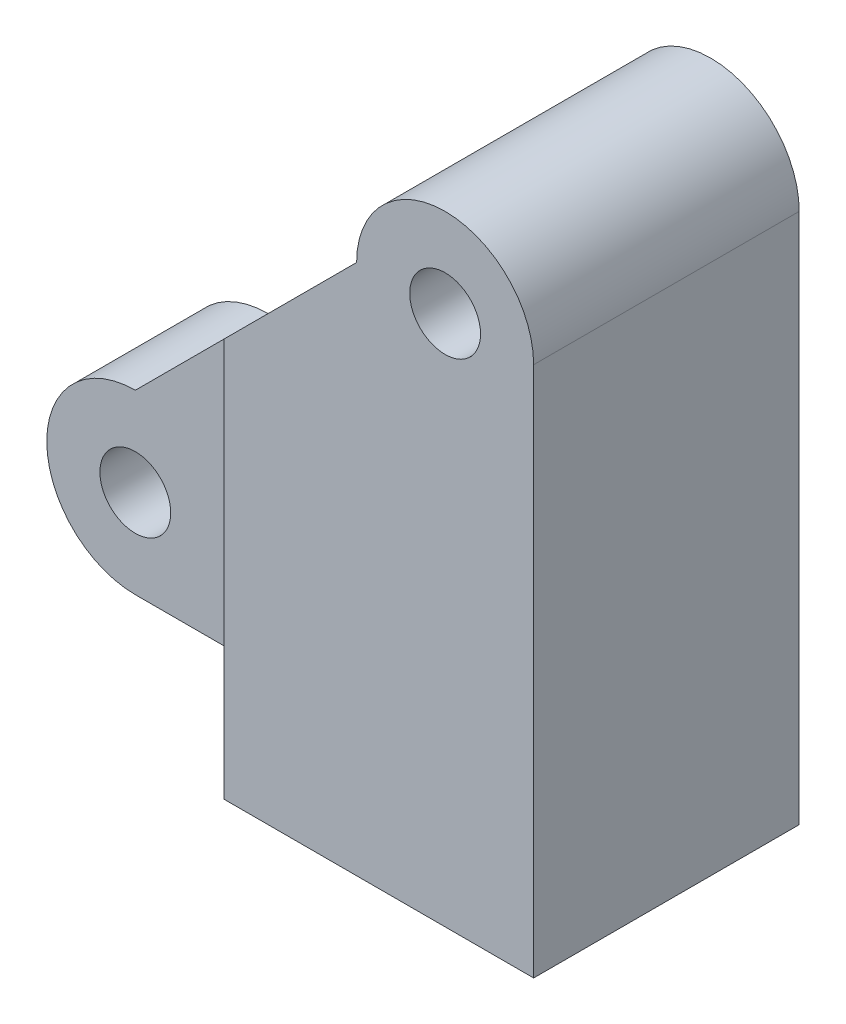
ISO-10303-21;
HEADER;
FILE_DESCRIPTION(('STEP AP214'),'2;1');
FILE_NAME('part.step','',(''),(''),'','','');
FILE_SCHEMA(('AUTOMOTIVE_DESIGN { 1 0 10303 214 1 1 1 1 }'));
ENDSEC;
DATA;
#1=APPLICATION_CONTEXT('core data for automotive mechanical design processes');
#2=APPLICATION_PROTOCOL_DEFINITION('international standard','automotive_design',2000,#1);
#3=PRODUCT_CONTEXT('',#1,'mechanical');
#4=PRODUCT('Part','Part','',(#3));
#5=PRODUCT_RELATED_PRODUCT_CATEGORY('part','',(#4));
#6=PRODUCT_DEFINITION_FORMATION('','',#4);
#7=PRODUCT_DEFINITION_CONTEXT('part definition',#1,'design');
#8=PRODUCT_DEFINITION('design','',#6,#7);
#9=PRODUCT_DEFINITION_SHAPE('','',#8);
#10=(LENGTH_UNIT() NAMED_UNIT(*) SI_UNIT(.MILLI.,.METRE.));
#11=(NAMED_UNIT(*) PLANE_ANGLE_UNIT() SI_UNIT($,.RADIAN.));
#12=(NAMED_UNIT(*) SI_UNIT($,.STERADIAN.) SOLID_ANGLE_UNIT());
#13=UNCERTAINTY_MEASURE_WITH_UNIT(LENGTH_MEASURE(1.E-05),#10,'distance_accuracy_value','');
#14=(GEOMETRIC_REPRESENTATION_CONTEXT(3) GLOBAL_UNCERTAINTY_ASSIGNED_CONTEXT((#13)) GLOBAL_UNIT_ASSIGNED_CONTEXT((#10,
#11,#12)) REPRESENTATION_CONTEXT('',''));
#15=CARTESIAN_POINT('',(0.,0.,0.));
#16=DIRECTION('',(0.,0.,1.));
#17=DIRECTION('',(1.,0.,0.));
#18=AXIS2_PLACEMENT_3D('',#15,#16,#17);
#19=CARTESIAN_POINT('',(15.1311870527181,7.1746239044065,23.4600678301874));
#20=DIRECTION('',(0.,0.,-1.));
#21=DIRECTION('',(-1.,0.,0.));
#22=AXIS2_PLACEMENT_3D('',#19,#20,#21);
#23=CYLINDRICAL_SURFACE('',#22,6.);
#24=CARTESIAN_POINT('',(15.1311870527181,7.1746239044065,14.4600678301874));
#25=DIRECTION('',(0.,0.,1.));
#26=DIRECTION('',(1.,0.,0.));
#27=AXIS2_PLACEMENT_3D('',#24,#25,#26);
#28=CIRCLE('',#27,6.);
#29=CARTESIAN_POINT('',(15.1311870527181,13.1746239044065,14.4600678301874));
#30=VERTEX_POINT('',#29);
#31=CARTESIAN_POINT('',(15.1311870527181,1.17462390440649,14.4600678301874));
#32=VERTEX_POINT('',#31);
#33=EDGE_CURVE('E116',#30,#32,#28,.T.);
#34=ORIENTED_EDGE('',*,*,#33,.F.);
#35=DIRECTION('',(0.,0.,-1.));
#36=VECTOR('',#35,1.);
#37=CARTESIAN_POINT('',(15.1311870527181,13.1746239044065,23.4600678301874));
#38=LINE('',#37,#36);
#39=CARTESIAN_POINT('',(15.1311870527181,13.1746239044065,5.46006783018738));
#40=VERTEX_POINT('',#39);
#41=EDGE_CURVE('E85',#30,#40,#38,.T.);
#42=ORIENTED_EDGE('',*,*,#41,.T.);
#43=CARTESIAN_POINT('',(15.1311870527181,7.1746239044065,5.46006783018738));
#44=DIRECTION('',(0.,0.,1.));
#45=DIRECTION('',(1.,0.,0.));
#46=AXIS2_PLACEMENT_3D('',#43,#44,#45);
#47=CIRCLE('',#46,6.);
#48=CARTESIAN_POINT('',(15.1311870527181,1.17462390440649,5.46006783018738));
#49=VERTEX_POINT('',#48);
#50=EDGE_CURVE('E134',#40,#49,#47,.T.);
#51=ORIENTED_EDGE('',*,*,#50,.T.);
#52=DIRECTION('',(0.,0.,-1.));
#53=VECTOR('',#52,1.);
#54=CARTESIAN_POINT('',(15.1311870527181,1.17462390440649,23.4600678301874));
#55=LINE('',#54,#53);
#56=EDGE_CURVE('E11',#32,#49,#55,.T.);
#57=ORIENTED_EDGE('',*,*,#56,.F.);
#58=EDGE_LOOP('',(#34,#42,#51,#57));
#59=FACE_BOUND('',#58,.T.);
#60=ADVANCED_FACE('F39',(#59),#23,.T.);
#61=CARTESIAN_POINT('',(15.1311870527181,7.1746239044065,23.4600678301874));
#62=DIRECTION('',(0.,0.,-1.));
#63=DIRECTION('',(-1.,0.,0.));
#64=AXIS2_PLACEMENT_3D('',#61,#62,#63);
#65=CYLINDRICAL_SURFACE('',#64,2.4);
#66=CARTESIAN_POINT('',(15.1311870527181,7.1746239044065,5.46006783018738));
#67=DIRECTION('',(0.,0.,1.));
#68=DIRECTION('',(1.,0.,0.));
#69=AXIS2_PLACEMENT_3D('',#66,#67,#68);
#70=CIRCLE('',#69,2.4);
#71=CARTESIAN_POINT('',(17.5311870527181,7.1746239044065,5.46006783018738));
#72=VERTEX_POINT('',#71);
#73=EDGE_CURVE('E123',#72,#72,#70,.T.);
#74=ORIENTED_EDGE('',*,*,#73,.F.);
#75=EDGE_LOOP('',(#74));
#76=FACE_BOUND('',#75,.T.);
#77=CARTESIAN_POINT('',(15.1311870527181,7.1746239044065,14.4600678301874));
#78=DIRECTION('',(0.,0.,1.));
#79=DIRECTION('',(1.,0.,0.));
#80=AXIS2_PLACEMENT_3D('',#77,#78,#79);
#81=CIRCLE('',#80,2.4);
#82=CARTESIAN_POINT('',(17.5311870527181,7.1746239044065,14.4600678301874));
#83=VERTEX_POINT('',#82);
#84=EDGE_CURVE('E119',#83,#83,#81,.F.);
#85=ORIENTED_EDGE('',*,*,#84,.F.);
#86=EDGE_LOOP('',(#85));
#87=FACE_BOUND('',#86,.T.);
#88=ADVANCED_FACE('F183',(#76,#87),#65,.F.);
#89=CARTESIAN_POINT('',(15.1311870527181,7.1746239044065,23.4600678301874));
#90=DIRECTION('',(0.,0.,1.));
#91=DIRECTION('',(1.,0.,0.));
#92=AXIS2_PLACEMENT_3D('',#89,#90,#91);
#93=PLANE('',#92);
#94=DIRECTION('',(0.,1.,0.));
#95=VECTOR('',#94,1.);
#96=CARTESIAN_POINT('',(30.1311870527181,7.1746239044065,23.4600678301874));
#97=LINE('',#96,#95);
#98=CARTESIAN_POINT('',(30.1311870527181,1.17462390440649,23.4600678301874));
#99=VERTEX_POINT('',#98);
#100=CARTESIAN_POINT('',(30.1311870527181,28.1746239044065,23.4600678301874));
#101=VERTEX_POINT('',#100);
#102=EDGE_CURVE('E178',#99,#101,#97,.T.);
#103=ORIENTED_EDGE('',*,*,#102,.F.);
#104=DIRECTION('',(1.,0.,0.));
#105=VECTOR('',#104,1.);
#106=CARTESIAN_POINT('',(15.1311870527181,1.17462390440649,23.4600678301874));
#107=LINE('',#106,#105);
#108=CARTESIAN_POINT('',(51.1311870527181,1.17462390440649,23.4600678301874));
#109=VERTEX_POINT('',#108);
#110=EDGE_CURVE('E90',#99,#109,#107,.T.);
#111=ORIENTED_EDGE('',*,*,#110,.T.);
#112=DIRECTION('',(0.,1.,0.));
#113=VECTOR('',#112,1.);
#114=CARTESIAN_POINT('',(51.1311870527181,1.17462390440649,23.4600678301874));
#115=LINE('',#114,#113);
#116=CARTESIAN_POINT('',(51.1311870527181,37.1746239044065,23.4600678301874));
#117=VERTEX_POINT('',#116);
#118=EDGE_CURVE('E138',#109,#117,#115,.T.);
#119=ORIENTED_EDGE('',*,*,#118,.T.);
#120=CARTESIAN_POINT('',(45.1311870527181,37.1746239044065,23.4600678301874));
#121=DIRECTION('',(0.,0.,1.));
#122=DIRECTION('',(1.,0.,0.));
#123=AXIS2_PLACEMENT_3D('',#120,#121,#122);
#124=CIRCLE('',#123,6.);
#125=CARTESIAN_POINT('',(39.1311870527181,37.1746239044065,23.4600678301874));
#126=VERTEX_POINT('',#125);
#127=EDGE_CURVE('E62',#117,#126,#124,.T.);
#128=ORIENTED_EDGE('',*,*,#127,.T.);
#129=DIRECTION('',(-0.707106781186548,-0.707106781186548,0.));
#130=VECTOR('',#129,1.);
#131=CARTESIAN_POINT('',(39.1311870527181,37.1746239044065,23.4600678301874));
#132=LINE('',#131,#130);
#133=EDGE_CURVE('E142',#126,#101,#132,.T.);
#134=ORIENTED_EDGE('',*,*,#133,.T.);
#135=EDGE_LOOP('',(#103,#111,#119,#128,#134));
#136=FACE_BOUND('',#135,.T.);
#137=CARTESIAN_POINT('',(45.1311870527181,37.1746239044065,23.4600678301874));
#138=DIRECTION('',(0.,0.,1.));
#139=DIRECTION('',(1.,0.,0.));
#140=AXIS2_PLACEMENT_3D('',#137,#138,#139);
#141=CIRCLE('',#140,2.4);
#142=CARTESIAN_POINT('',(47.5311870527181,37.1746239044065,23.4600678301874));
#143=VERTEX_POINT('',#142);
#144=EDGE_CURVE('E131',#143,#143,#141,.T.);
#145=ORIENTED_EDGE('',*,*,#144,.F.);
#146=EDGE_LOOP('',(#145));
#147=FACE_BOUND('',#146,.T.);
#148=ADVANCED_FACE('F176',(#136,#147),#93,.T.);
#149=CARTESIAN_POINT('',(15.1311870527181,7.1746239044065,5.46006783018738));
#150=DIRECTION('',(0.,0.,1.));
#151=DIRECTION('',(1.,0.,0.));
#152=AXIS2_PLACEMENT_3D('',#149,#150,#151);
#153=PLANE('',#152);
#154=ORIENTED_EDGE('',*,*,#50,.F.);
#155=DIRECTION('',(-0.707106781186548,-0.707106781186548,0.));
#156=VECTOR('',#155,1.);
#157=CARTESIAN_POINT('',(39.1311870527181,37.1746239044065,5.46006783018738));
#158=LINE('',#157,#156);
#159=CARTESIAN_POINT('',(39.1311870527181,37.1746239044065,5.46006783018738));
#160=VERTEX_POINT('',#159);
#161=EDGE_CURVE('E139',#160,#40,#158,.T.);
#162=ORIENTED_EDGE('',*,*,#161,.F.);
#163=CARTESIAN_POINT('',(45.1311870527181,37.1746239044065,5.46006783018738));
#164=DIRECTION('',(0.,0.,1.));
#165=DIRECTION('',(1.,0.,0.));
#166=AXIS2_PLACEMENT_3D('',#163,#164,#165);
#167=CIRCLE('',#166,6.);
#168=CARTESIAN_POINT('',(51.1311870527181,37.1746239044065,5.46006783018738));
#169=VERTEX_POINT('',#168);
#170=EDGE_CURVE('E149',#169,#160,#167,.T.);
#171=ORIENTED_EDGE('',*,*,#170,.F.);
#172=DIRECTION('',(0.,1.,0.));
#173=VECTOR('',#172,1.);
#174=CARTESIAN_POINT('',(51.1311870527181,1.17462390440649,5.46006783018738));
#175=LINE('',#174,#173);
#176=CARTESIAN_POINT('',(51.1311870527181,1.17462390440649,5.46006783018738));
#177=VERTEX_POINT('',#176);
#178=EDGE_CURVE('E147',#177,#169,#175,.T.);
#179=ORIENTED_EDGE('',*,*,#178,.F.);
#180=DIRECTION('',(1.,0.,0.));
#181=VECTOR('',#180,1.);
#182=CARTESIAN_POINT('',(15.1311870527181,1.17462390440649,5.46006783018738));
#183=LINE('',#182,#181);
#184=EDGE_CURVE('E145',#49,#177,#183,.T.);
#185=ORIENTED_EDGE('',*,*,#184,.F.);
#186=EDGE_LOOP('',(#154,#162,#171,#179,#185));
#187=FACE_BOUND('',#186,.T.);
#188=CARTESIAN_POINT('',(45.1311870527181,37.1746239044065,5.46006783018738));
#189=DIRECTION('',(0.,0.,1.));
#190=DIRECTION('',(1.,0.,0.));
#191=AXIS2_PLACEMENT_3D('',#188,#189,#190);
#192=CIRCLE('',#191,2.4);
#193=CARTESIAN_POINT('',(47.5311870527181,37.1746239044065,5.46006783018738));
#194=VERTEX_POINT('',#193);
#195=EDGE_CURVE('E130',#194,#194,#192,.T.);
#196=ORIENTED_EDGE('',*,*,#195,.T.);
#197=EDGE_LOOP('',(#196));
#198=FACE_BOUND('',#197,.T.);
#199=ORIENTED_EDGE('',*,*,#73,.T.);
#200=EDGE_LOOP('',(#199));
#201=FACE_BOUND('',#200,.T.);
#202=ADVANCED_FACE('F168',(#187,#198,#201),#153,.F.);
#203=CARTESIAN_POINT('',(15.1311870527181,1.17462390440649,23.4600678301874));
#204=DIRECTION('',(0.,1.,0.));
#205=DIRECTION('',(0.,0.,1.));
#206=AXIS2_PLACEMENT_3D('',#203,#204,#205);
#207=PLANE('',#206);
#208=ORIENTED_EDGE('',*,*,#110,.F.);
#209=DIRECTION('',(0.,0.,1.));
#210=VECTOR('',#209,1.);
#211=CARTESIAN_POINT('',(30.1311870527181,1.17462390440649,14.4600678301874));
#212=LINE('',#211,#210);
#213=CARTESIAN_POINT('',(30.1311870527181,1.17462390440649,14.4600678301874));
#214=VERTEX_POINT('',#213);
#215=EDGE_CURVE('E107',#214,#99,#212,.T.);
#216=ORIENTED_EDGE('',*,*,#215,.F.);
#217=DIRECTION('',(1.,0.,0.));
#218=VECTOR('',#217,1.);
#219=CARTESIAN_POINT('',(15.1311870527181,1.17462390440649,14.4600678301874));
#220=LINE('',#219,#218);
#221=EDGE_CURVE('E112',#32,#214,#220,.T.);
#222=ORIENTED_EDGE('',*,*,#221,.F.);
#223=ORIENTED_EDGE('',*,*,#56,.T.);
#224=ORIENTED_EDGE('',*,*,#184,.T.);
#225=DIRECTION('',(0.,0.,-1.));
#226=VECTOR('',#225,1.);
#227=CARTESIAN_POINT('',(51.1311870527181,1.17462390440649,23.4600678301874));
#228=LINE('',#227,#226);
#229=EDGE_CURVE('E46',#109,#177,#228,.T.);
#230=ORIENTED_EDGE('',*,*,#229,.F.);
#231=EDGE_LOOP('',(#208,#216,#222,#223,#224,#230));
#232=FACE_BOUND('',#231,.T.);
#233=ADVANCED_FACE('F121',(#232),#207,.F.);
#234=CARTESIAN_POINT('',(51.1311870527181,1.17462390440649,23.4600678301874));
#235=DIRECTION('',(-1.,0.,0.));
#236=DIRECTION('',(0.,0.,1.));
#237=AXIS2_PLACEMENT_3D('',#234,#235,#236);
#238=PLANE('',#237);
#239=ORIENTED_EDGE('',*,*,#178,.T.);
#240=DIRECTION('',(0.,0.,-1.));
#241=VECTOR('',#240,1.);
#242=CARTESIAN_POINT('',(51.1311870527181,37.1746239044065,23.4600678301874));
#243=LINE('',#242,#241);
#244=EDGE_CURVE('E156',#117,#169,#243,.T.);
#245=ORIENTED_EDGE('',*,*,#244,.F.);
#246=ORIENTED_EDGE('',*,*,#118,.F.);
#247=ORIENTED_EDGE('',*,*,#229,.T.);
#248=EDGE_LOOP('',(#239,#245,#246,#247));
#249=FACE_BOUND('',#248,.T.);
#250=ADVANCED_FACE('F162',(#249),#238,.F.);
#251=CARTESIAN_POINT('',(45.1311870527181,37.1746239044065,23.4600678301874));
#252=DIRECTION('',(0.,0.,-1.));
#253=DIRECTION('',(-1.,0.,0.));
#254=AXIS2_PLACEMENT_3D('',#251,#252,#253);
#255=CYLINDRICAL_SURFACE('',#254,6.);
#256=ORIENTED_EDGE('',*,*,#170,.T.);
#257=DIRECTION('',(0.,0.,-1.));
#258=VECTOR('',#257,1.);
#259=CARTESIAN_POINT('',(39.1311870527181,37.1746239044065,23.4600678301874));
#260=LINE('',#259,#258);
#261=EDGE_CURVE('E153',#126,#160,#260,.T.);
#262=ORIENTED_EDGE('',*,*,#261,.F.);
#263=ORIENTED_EDGE('',*,*,#127,.F.);
#264=ORIENTED_EDGE('',*,*,#244,.T.);
#265=EDGE_LOOP('',(#256,#262,#263,#264));
#266=FACE_BOUND('',#265,.T.);
#267=ADVANCED_FACE('F172',(#266),#255,.T.);
#268=CARTESIAN_POINT('',(39.1311870527181,37.1746239044065,23.4600678301874));
#269=DIRECTION('',(0.707106781186547,-0.707106781186547,0.));
#270=DIRECTION('',(0.707106781186548,0.707106781186548,0.));
#271=AXIS2_PLACEMENT_3D('',#268,#269,#270);
#272=PLANE('',#271);
#273=DIRECTION('',(-0.707106781186548,-0.707106781186548,0.));
#274=VECTOR('',#273,1.);
#275=CARTESIAN_POINT('',(12.1311870527181,10.1746239044065,14.4600678301874));
#276=LINE('',#275,#274);
#277=CARTESIAN_POINT('',(30.1311870527181,28.1746239044065,14.4600678301874));
#278=VERTEX_POINT('',#277);
#279=EDGE_CURVE('E111',#278,#30,#276,.T.);
#280=ORIENTED_EDGE('',*,*,#279,.F.);
#281=DIRECTION('',(0.,0.,1.));
#282=VECTOR('',#281,1.);
#283=CARTESIAN_POINT('',(30.1311870527181,28.1746239044065,14.4600678301874));
#284=LINE('',#283,#282);
#285=EDGE_CURVE('E109',#278,#101,#284,.T.);
#286=ORIENTED_EDGE('',*,*,#285,.T.);
#287=ORIENTED_EDGE('',*,*,#133,.F.);
#288=ORIENTED_EDGE('',*,*,#261,.T.);
#289=ORIENTED_EDGE('',*,*,#161,.T.);
#290=ORIENTED_EDGE('',*,*,#41,.F.);
#291=EDGE_LOOP('',(#280,#286,#287,#288,#289,#290));
#292=FACE_BOUND('',#291,.T.);
#293=ADVANCED_FACE('F175',(#292),#272,.F.);
#294=CARTESIAN_POINT('',(45.1311870527181,37.1746239044065,23.4600678301874));
#295=DIRECTION('',(0.,0.,-1.));
#296=DIRECTION('',(-1.,0.,0.));
#297=AXIS2_PLACEMENT_3D('',#294,#295,#296);
#298=CYLINDRICAL_SURFACE('',#297,2.4);
#299=ORIENTED_EDGE('',*,*,#144,.T.);
#300=EDGE_LOOP('',(#299));
#301=FACE_BOUND('',#300,.T.);
#302=ORIENTED_EDGE('',*,*,#195,.F.);
#303=EDGE_LOOP('',(#302));
#304=FACE_BOUND('',#303,.T.);
#305=ADVANCED_FACE('F198',(#301,#304),#298,.F.);
#306=CARTESIAN_POINT('',(30.1311870527181,7.1746239044065,14.4600678301874));
#307=DIRECTION('',(1.,0.,0.));
#308=DIRECTION('',(0.,1.,0.));
#309=AXIS2_PLACEMENT_3D('',#306,#307,#308);
#310=PLANE('',#309);
#311=ORIENTED_EDGE('',*,*,#102,.T.);
#312=ORIENTED_EDGE('',*,*,#285,.F.);
#313=DIRECTION('',(0.,1.,0.));
#314=VECTOR('',#313,1.);
#315=CARTESIAN_POINT('',(30.1311870527181,7.1746239044065,14.4600678301874));
#316=LINE('',#315,#314);
#317=EDGE_CURVE('E53',#214,#278,#316,.T.);
#318=ORIENTED_EDGE('',*,*,#317,.F.);
#319=ORIENTED_EDGE('',*,*,#215,.T.);
#320=EDGE_LOOP('',(#311,#312,#318,#319));
#321=FACE_BOUND('',#320,.T.);
#322=ADVANCED_FACE('F105',(#321),#310,.F.);
#323=CARTESIAN_POINT('',(15.1311870527181,7.1746239044065,14.4600678301874));
#324=DIRECTION('',(0.,0.,1.));
#325=DIRECTION('',(1.,0.,0.));
#326=AXIS2_PLACEMENT_3D('',#323,#324,#325);
#327=PLANE('',#326);
#328=ORIENTED_EDGE('',*,*,#84,.T.);
#329=EDGE_LOOP('',(#328));
#330=FACE_BOUND('',#329,.T.);
#331=ORIENTED_EDGE('',*,*,#221,.T.);
#332=ORIENTED_EDGE('',*,*,#317,.T.);
#333=ORIENTED_EDGE('',*,*,#279,.T.);
#334=ORIENTED_EDGE('',*,*,#33,.T.);
#335=EDGE_LOOP('',(#331,#332,#333,#334));
#336=FACE_BOUND('',#335,.T.);
#337=ADVANCED_FACE('F115',(#330,#336),#327,.T.);
#338=CLOSED_SHELL('',(#60,#88,#148,#202,#233,#250,#267,#293,#305,#322,#337));
#339=MANIFOLD_SOLID_BREP('B2',#338);
#340=ADVANCED_BREP_SHAPE_REPRESENTATION('',(#18,#339),#14);
#341=SHAPE_DEFINITION_REPRESENTATION(#9,#340);
ENDSEC;
END-ISO-10303-21;
